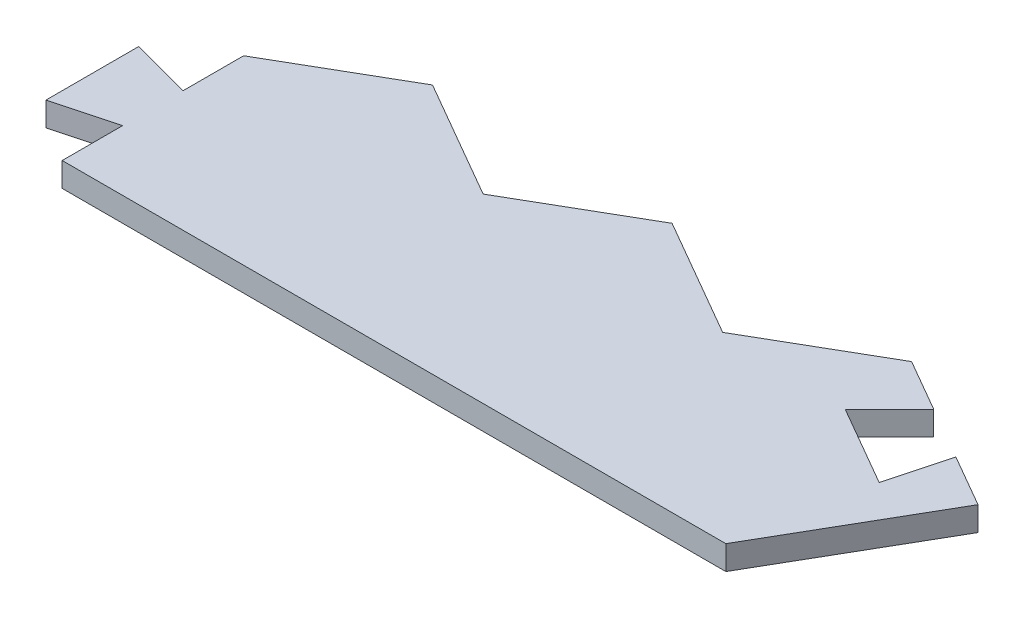
ISO-10303-21;
HEADER;
FILE_DESCRIPTION(('STEP AP214'),'2;1');
FILE_NAME('part.step','',(''),(''),'','','');
FILE_SCHEMA(('AUTOMOTIVE_DESIGN { 1 0 10303 214 1 1 1 1 }'));
ENDSEC;
DATA;
#1=APPLICATION_CONTEXT('core data for automotive mechanical design processes');
#2=APPLICATION_PROTOCOL_DEFINITION('international standard','automotive_design',2000,#1);
#3=PRODUCT_CONTEXT('',#1,'mechanical');
#4=PRODUCT('Part','Part','',(#3));
#5=PRODUCT_RELATED_PRODUCT_CATEGORY('part','',(#4));
#6=PRODUCT_DEFINITION_FORMATION('','',#4);
#7=PRODUCT_DEFINITION_CONTEXT('part definition',#1,'design');
#8=PRODUCT_DEFINITION('design','',#6,#7);
#9=PRODUCT_DEFINITION_SHAPE('','',#8);
#10=(LENGTH_UNIT() NAMED_UNIT(*) SI_UNIT(.MILLI.,.METRE.));
#11=(NAMED_UNIT(*) PLANE_ANGLE_UNIT() SI_UNIT($,.RADIAN.));
#12=(NAMED_UNIT(*) SI_UNIT($,.STERADIAN.) SOLID_ANGLE_UNIT());
#13=UNCERTAINTY_MEASURE_WITH_UNIT(LENGTH_MEASURE(1.E-05),#10,'distance_accuracy_value','');
#14=(GEOMETRIC_REPRESENTATION_CONTEXT(3) GLOBAL_UNCERTAINTY_ASSIGNED_CONTEXT((#13)) GLOBAL_UNIT_ASSIGNED_CONTEXT((#10,
#11,#12)) REPRESENTATION_CONTEXT('',''));
#15=CARTESIAN_POINT('',(0.,0.,0.));
#16=DIRECTION('',(0.,0.,1.));
#17=DIRECTION('',(1.,0.,0.));
#18=AXIS2_PLACEMENT_3D('',#15,#16,#17);
#19=CARTESIAN_POINT('',(0.,8.,0.));
#20=DIRECTION('',(1.,0.,0.));
#21=DIRECTION('',(0.,0.,-1.));
#22=AXIS2_PLACEMENT_3D('',#19,#20,#21);
#23=PLANE('',#22);
#24=DIRECTION('',(0.,0.,1.));
#25=VECTOR('',#24,1.);
#26=CARTESIAN_POINT('',(0.,0.,0.));
#27=LINE('',#26,#25);
#28=CARTESIAN_POINT('',(0.,0.,-20.));
#29=VERTEX_POINT('',#28);
#30=CARTESIAN_POINT('',(0.,0.,0.));
#31=VERTEX_POINT('',#30);
#32=EDGE_CURVE('E182',#29,#31,#27,.T.);
#33=ORIENTED_EDGE('',*,*,#32,.T.);
#34=DIRECTION('',(0.,-1.,0.));
#35=VECTOR('',#34,1.);
#36=CARTESIAN_POINT('',(0.,8.,0.));
#37=LINE('',#36,#35);
#38=CARTESIAN_POINT('',(0.,8.,0.));
#39=VERTEX_POINT('',#38);
#40=EDGE_CURVE('E11',#39,#31,#37,.T.);
#41=ORIENTED_EDGE('',*,*,#40,.F.);
#42=DIRECTION('',(0.,0.,1.));
#43=VECTOR('',#42,1.);
#44=CARTESIAN_POINT('',(0.,8.,0.));
#45=LINE('',#44,#43);
#46=CARTESIAN_POINT('',(0.,8.,-20.));
#47=VERTEX_POINT('',#46);
#48=EDGE_CURVE('E214',#47,#39,#45,.T.);
#49=ORIENTED_EDGE('',*,*,#48,.F.);
#50=DIRECTION('',(0.,-1.,0.));
#51=VECTOR('',#50,1.);
#52=CARTESIAN_POINT('',(0.,8.,-20.));
#53=LINE('',#52,#51);
#54=EDGE_CURVE('E178',#47,#29,#53,.T.);
#55=ORIENTED_EDGE('',*,*,#54,.T.);
#56=EDGE_LOOP('',(#33,#41,#49,#55));
#57=FACE_BOUND('',#56,.T.);
#58=ADVANCED_FACE('F32',(#57),#23,.F.);
#59=CARTESIAN_POINT('',(0.,8.,0.));
#60=DIRECTION('',(0.,0.,-1.));
#61=DIRECTION('',(-1.,0.,0.));
#62=AXIS2_PLACEMENT_3D('',#59,#60,#61);
#63=PLANE('',#62);
#64=DIRECTION('',(1.,0.,0.));
#65=VECTOR('',#64,1.);
#66=CARTESIAN_POINT('',(0.,0.,0.));
#67=LINE('',#66,#65);
#68=CARTESIAN_POINT('',(219.497025340512,0.,0.));
#69=VERTEX_POINT('',#68);
#70=EDGE_CURVE('E185',#31,#69,#67,.T.);
#71=ORIENTED_EDGE('',*,*,#70,.T.);
#72=DIRECTION('',(0.,-1.,0.));
#73=VECTOR('',#72,1.);
#74=CARTESIAN_POINT('',(219.497025340512,8.,0.));
#75=LINE('',#74,#73);
#76=CARTESIAN_POINT('',(219.497025340512,8.,0.));
#77=VERTEX_POINT('',#76);
#78=EDGE_CURVE('E40',#77,#69,#75,.T.);
#79=ORIENTED_EDGE('',*,*,#78,.F.);
#80=DIRECTION('',(1.,0.,0.));
#81=VECTOR('',#80,1.);
#82=CARTESIAN_POINT('',(0.,8.,0.));
#83=LINE('',#82,#81);
#84=EDGE_CURVE('E118',#39,#77,#83,.T.);
#85=ORIENTED_EDGE('',*,*,#84,.F.);
#86=ORIENTED_EDGE('',*,*,#40,.T.);
#87=EDGE_LOOP('',(#71,#79,#85,#86));
#88=FACE_BOUND('',#87,.T.);
#89=ADVANCED_FACE('F317',(#88),#63,.F.);
#90=CARTESIAN_POINT('',(219.497025340512,8.,0.));
#91=DIRECTION('',(-0.86602540378444,0.,-0.499999999999998));
#92=DIRECTION('',(-0.499999999999998,0.,0.86602540378444));
#93=AXIS2_PLACEMENT_3D('',#90,#91,#92);
#94=PLANE('',#93);
#95=DIRECTION('',(0.499999999999998,0.,-0.86602540378444));
#96=VECTOR('',#95,1.);
#97=CARTESIAN_POINT('',(219.497025340512,0.,0.));
#98=LINE('',#97,#96);
#99=CARTESIAN_POINT('',(250.021534072567,0.,-52.8699999999997));
#100=VERTEX_POINT('',#99);
#101=EDGE_CURVE('E187',#69,#100,#98,.T.);
#102=ORIENTED_EDGE('',*,*,#101,.T.);
#103=DIRECTION('',(0.,-1.,0.));
#104=VECTOR('',#103,1.);
#105=CARTESIAN_POINT('',(250.021534072567,8.,-52.8699999999997));
#106=LINE('',#105,#104);
#107=CARTESIAN_POINT('',(250.021534072567,8.,-52.8699999999997));
#108=VERTEX_POINT('',#107);
#109=EDGE_CURVE('E248',#108,#100,#106,.T.);
#110=ORIENTED_EDGE('',*,*,#109,.F.);
#111=DIRECTION('',(0.499999999999998,0.,-0.86602540378444));
#112=VECTOR('',#111,1.);
#113=CARTESIAN_POINT('',(219.497025340512,8.,0.));
#114=LINE('',#113,#112);
#115=EDGE_CURVE('E256',#77,#108,#114,.T.);
#116=ORIENTED_EDGE('',*,*,#115,.F.);
#117=ORIENTED_EDGE('',*,*,#78,.T.);
#118=EDGE_LOOP('',(#102,#110,#116,#117));
#119=FACE_BOUND('',#118,.T.);
#120=ADVANCED_FACE('F254',(#119),#94,.F.);
#121=CARTESIAN_POINT('',(232.701025996879,8.,-62.8699999999998));
#122=DIRECTION('',(-0.500000000000004,0.,0.866025403784436));
#123=DIRECTION('',(0.866025403784436,0.,0.500000000000004));
#124=AXIS2_PLACEMENT_3D('',#121,#122,#123);
#125=PLANE('',#124);
#126=DIRECTION('',(-0.866025403784436,0.,-0.500000000000004));
#127=VECTOR('',#126,1.);
#128=CARTESIAN_POINT('',(232.701025996879,0.,-62.8699999999998));
#129=LINE('',#128,#127);
#130=CARTESIAN_POINT('',(232.701025996879,0.,-62.8699999999998));
#131=VERTEX_POINT('',#130);
#132=EDGE_CURVE('E189',#100,#131,#129,.T.);
#133=ORIENTED_EDGE('',*,*,#132,.T.);
#134=DIRECTION('',(0.,-1.,0.));
#135=VECTOR('',#134,1.);
#136=CARTESIAN_POINT('',(232.701025996879,8.,-62.8699999999998));
#137=LINE('',#136,#135);
#138=CARTESIAN_POINT('',(232.701025996879,8.,-62.8699999999998));
#139=VERTEX_POINT('',#138);
#140=EDGE_CURVE('E245',#139,#131,#137,.T.);
#141=ORIENTED_EDGE('',*,*,#140,.F.);
#142=DIRECTION('',(-0.866025403784436,0.,-0.500000000000004));
#143=VECTOR('',#142,1.);
#144=CARTESIAN_POINT('',(232.701025996879,8.,-62.8699999999998));
#145=LINE('',#144,#143);
#146=EDGE_CURVE('E274',#108,#139,#145,.T.);
#147=ORIENTED_EDGE('',*,*,#146,.F.);
#148=ORIENTED_EDGE('',*,*,#109,.T.);
#149=EDGE_LOOP('',(#133,#141,#147,#148));
#150=FACE_BOUND('',#149,.T.);
#151=ADVANCED_FACE('F265',(#150),#125,.F.);
#152=CARTESIAN_POINT('',(227.342042148256,8.,-42.8699999999998));
#153=DIRECTION('',(0.965925826289068,0.,0.258819045102521));
#154=DIRECTION('',(0.258819045102521,0.,-0.965925826289068));
#155=AXIS2_PLACEMENT_3D('',#152,#153,#154);
#156=PLANE('',#155);
#157=DIRECTION('',(-0.258819045102521,0.,0.965925826289068));
#158=VECTOR('',#157,1.);
#159=CARTESIAN_POINT('',(227.342042148256,0.,-42.8699999999998));
#160=LINE('',#159,#158);
#161=CARTESIAN_POINT('',(227.342042148256,0.,-42.8699999999998));
#162=VERTEX_POINT('',#161);
#163=EDGE_CURVE('E191',#131,#162,#160,.T.);
#164=ORIENTED_EDGE('',*,*,#163,.T.);
#165=DIRECTION('',(0.,-1.,0.));
#166=VECTOR('',#165,1.);
#167=CARTESIAN_POINT('',(227.342042148256,8.,-42.8699999999998));
#168=LINE('',#167,#166);
#169=CARTESIAN_POINT('',(227.342042148256,8.,-42.8699999999998));
#170=VERTEX_POINT('',#169);
#171=EDGE_CURVE('E242',#170,#162,#168,.T.);
#172=ORIENTED_EDGE('',*,*,#171,.F.);
#173=DIRECTION('',(-0.258819045102521,0.,0.965925826289068));
#174=VECTOR('',#173,1.);
#175=CARTESIAN_POINT('',(227.342042148256,8.,-42.8699999999998));
#176=LINE('',#175,#174);
#177=EDGE_CURVE('E271',#139,#170,#176,.T.);
#178=ORIENTED_EDGE('',*,*,#177,.F.);
#179=ORIENTED_EDGE('',*,*,#140,.T.);
#180=EDGE_LOOP('',(#164,#172,#178,#179));
#181=FACE_BOUND('',#180,.T.);
#182=ADVANCED_FACE('F269',(#181),#156,.F.);
#183=CARTESIAN_POINT('',(200.739501769812,8.,-58.2289838486224));
#184=DIRECTION('',(-0.500000000000003,0.,0.866025403784437));
#185=DIRECTION('',(0.866025403784437,0.,0.500000000000003));
#186=AXIS2_PLACEMENT_3D('',#183,#184,#185);
#187=PLANE('',#186);
#188=DIRECTION('',(-0.866025403784437,0.,-0.500000000000003));
#189=VECTOR('',#188,1.);
#190=CARTESIAN_POINT('',(200.739501769812,0.,-58.2289838486224));
#191=LINE('',#190,#189);
#192=CARTESIAN_POINT('',(200.739501769812,0.,-58.2289838486224));
#193=VERTEX_POINT('',#192);
#194=EDGE_CURVE('E193',#162,#193,#191,.T.);
#195=ORIENTED_EDGE('',*,*,#194,.T.);
#196=DIRECTION('',(0.,-1.,0.));
#197=VECTOR('',#196,1.);
#198=CARTESIAN_POINT('',(200.739501769812,8.,-58.2289838486224));
#199=LINE('',#198,#197);
#200=CARTESIAN_POINT('',(200.739501769812,8.,-58.2289838486224));
#201=VERTEX_POINT('',#200);
#202=EDGE_CURVE('E239',#201,#193,#199,.T.);
#203=ORIENTED_EDGE('',*,*,#202,.F.);
#204=DIRECTION('',(-0.866025403784437,0.,-0.500000000000003));
#205=VECTOR('',#204,1.);
#206=CARTESIAN_POINT('',(200.739501769812,8.,-58.2289838486224));
#207=LINE('',#206,#205);
#208=EDGE_CURVE('E273',#170,#201,#207,.T.);
#209=ORIENTED_EDGE('',*,*,#208,.F.);
#210=ORIENTED_EDGE('',*,*,#171,.T.);
#211=EDGE_LOOP('',(#195,#203,#209,#210));
#212=FACE_BOUND('',#211,.T.);
#213=ADVANCED_FACE('F330',(#212),#187,.F.);
#214=CARTESIAN_POINT('',(215.38051792119,8.,-72.8699999999998));
#215=DIRECTION('',(-0.707106781186541,0.,-0.707106781186554));
#216=DIRECTION('',(-0.707106781186554,0.,0.707106781186541));
#217=AXIS2_PLACEMENT_3D('',#214,#215,#216);
#218=PLANE('',#217);
#219=DIRECTION('',(0.707106781186554,0.,-0.707106781186541));
#220=VECTOR('',#219,1.);
#221=CARTESIAN_POINT('',(215.38051792119,0.,-72.8699999999998));
#222=LINE('',#221,#220);
#223=CARTESIAN_POINT('',(215.38051792119,0.,-72.8699999999998));
#224=VERTEX_POINT('',#223);
#225=EDGE_CURVE('E195',#193,#224,#222,.T.);
#226=ORIENTED_EDGE('',*,*,#225,.T.);
#227=DIRECTION('',(0.,-1.,0.));
#228=VECTOR('',#227,1.);
#229=CARTESIAN_POINT('',(215.38051792119,8.,-72.8699999999998));
#230=LINE('',#229,#228);
#231=CARTESIAN_POINT('',(215.38051792119,8.,-72.8699999999998));
#232=VERTEX_POINT('',#231);
#233=EDGE_CURVE('E236',#232,#224,#230,.T.);
#234=ORIENTED_EDGE('',*,*,#233,.F.);
#235=DIRECTION('',(0.707106781186554,0.,-0.707106781186541));
#236=VECTOR('',#235,1.);
#237=CARTESIAN_POINT('',(215.38051792119,8.,-72.8699999999998));
#238=LINE('',#237,#236);
#239=EDGE_CURVE('E276',#201,#232,#238,.T.);
#240=ORIENTED_EDGE('',*,*,#239,.F.);
#241=ORIENTED_EDGE('',*,*,#202,.T.);
#242=EDGE_LOOP('',(#226,#234,#240,#241));
#243=FACE_BOUND('',#242,.T.);
#244=ADVANCED_FACE('F333',(#243),#218,.F.);
#245=CARTESIAN_POINT('',(198.060009845501,8.,-82.8699999999999));
#246=DIRECTION('',(-0.500000000000001,0.,0.866025403784438));
#247=DIRECTION('',(0.866025403784438,0.,0.500000000000001));
#248=AXIS2_PLACEMENT_3D('',#245,#246,#247);
#249=PLANE('',#248);
#250=DIRECTION('',(-0.866025403784438,0.,-0.500000000000001));
#251=VECTOR('',#250,1.);
#252=CARTESIAN_POINT('',(198.060009845501,0.,-82.8699999999999));
#253=LINE('',#252,#251);
#254=CARTESIAN_POINT('',(198.060009845501,0.,-82.8699999999999));
#255=VERTEX_POINT('',#254);
#256=EDGE_CURVE('E197',#224,#255,#253,.T.);
#257=ORIENTED_EDGE('',*,*,#256,.T.);
#258=DIRECTION('',(0.,-1.,0.));
#259=VECTOR('',#258,1.);
#260=CARTESIAN_POINT('',(198.060009845501,8.,-82.8699999999999));
#261=LINE('',#260,#259);
#262=CARTESIAN_POINT('',(198.060009845501,8.,-82.8699999999999));
#263=VERTEX_POINT('',#262);
#264=EDGE_CURVE('E233',#263,#255,#261,.T.);
#265=ORIENTED_EDGE('',*,*,#264,.F.);
#266=DIRECTION('',(-0.866025403784438,0.,-0.500000000000001));
#267=VECTOR('',#266,1.);
#268=CARTESIAN_POINT('',(198.060009845501,8.,-82.8699999999999));
#269=LINE('',#268,#267);
#270=EDGE_CURVE('E282',#232,#263,#269,.T.);
#271=ORIENTED_EDGE('',*,*,#270,.F.);
#272=ORIENTED_EDGE('',*,*,#233,.T.);
#273=EDGE_LOOP('',(#257,#265,#271,#272));
#274=FACE_BOUND('',#273,.T.);
#275=ADVANCED_FACE('F337',(#274),#249,.F.);
#276=CARTESIAN_POINT('',(158.448007876401,8.,-60.));
#277=DIRECTION('',(0.499999999999999,0.,0.866025403784439));
#278=DIRECTION('',(0.866025403784439,0.,-0.499999999999999));
#279=AXIS2_PLACEMENT_3D('',#276,#277,#278);
#280=PLANE('',#279);
#281=DIRECTION('',(-0.866025403784439,0.,0.499999999999999));
#282=VECTOR('',#281,1.);
#283=CARTESIAN_POINT('',(158.448007876401,0.,-60.));
#284=LINE('',#283,#282);
#285=CARTESIAN_POINT('',(158.448007876401,0.,-60.));
#286=VERTEX_POINT('',#285);
#287=EDGE_CURVE('E199',#255,#286,#284,.T.);
#288=ORIENTED_EDGE('',*,*,#287,.T.);
#289=DIRECTION('',(0.,-1.,0.));
#290=VECTOR('',#289,1.);
#291=CARTESIAN_POINT('',(158.448007876401,8.,-60.));
#292=LINE('',#291,#290);
#293=CARTESIAN_POINT('',(158.448007876401,8.,-60.));
#294=VERTEX_POINT('',#293);
#295=EDGE_CURVE('E230',#294,#286,#292,.T.);
#296=ORIENTED_EDGE('',*,*,#295,.F.);
#297=DIRECTION('',(-0.866025403784439,0.,0.499999999999999));
#298=VECTOR('',#297,1.);
#299=CARTESIAN_POINT('',(158.448007876401,8.,-60.));
#300=LINE('',#299,#298);
#301=EDGE_CURVE('E284',#263,#294,#300,.T.);
#302=ORIENTED_EDGE('',*,*,#301,.F.);
#303=ORIENTED_EDGE('',*,*,#264,.T.);
#304=EDGE_LOOP('',(#288,#296,#302,#303));
#305=FACE_BOUND('',#304,.T.);
#306=ADVANCED_FACE('F341',(#305),#280,.F.);
#307=CARTESIAN_POINT('',(118.836005907301,8.,-82.8699999999999));
#308=DIRECTION('',(-0.500000000000004,0.,0.866025403784436));
#309=DIRECTION('',(0.866025403784436,0.,0.500000000000004));
#310=AXIS2_PLACEMENT_3D('',#307,#308,#309);
#311=PLANE('',#310);
#312=DIRECTION('',(-0.866025403784436,0.,-0.500000000000004));
#313=VECTOR('',#312,1.);
#314=CARTESIAN_POINT('',(118.836005907301,0.,-82.8699999999999));
#315=LINE('',#314,#313);
#316=CARTESIAN_POINT('',(118.836005907301,0.,-82.8699999999999));
#317=VERTEX_POINT('',#316);
#318=EDGE_CURVE('E201',#286,#317,#315,.T.);
#319=ORIENTED_EDGE('',*,*,#318,.T.);
#320=DIRECTION('',(0.,-1.,0.));
#321=VECTOR('',#320,1.);
#322=CARTESIAN_POINT('',(118.836005907301,8.,-82.8699999999999));
#323=LINE('',#322,#321);
#324=CARTESIAN_POINT('',(118.836005907301,8.,-82.8699999999999));
#325=VERTEX_POINT('',#324);
#326=EDGE_CURVE('E227',#325,#317,#323,.T.);
#327=ORIENTED_EDGE('',*,*,#326,.F.);
#328=DIRECTION('',(-0.866025403784436,0.,-0.500000000000004));
#329=VECTOR('',#328,1.);
#330=CARTESIAN_POINT('',(118.836005907301,8.,-82.8699999999999));
#331=LINE('',#330,#329);
#332=EDGE_CURVE('E286',#294,#325,#331,.T.);
#333=ORIENTED_EDGE('',*,*,#332,.F.);
#334=ORIENTED_EDGE('',*,*,#295,.T.);
#335=EDGE_LOOP('',(#319,#327,#333,#334));
#336=FACE_BOUND('',#335,.T.);
#337=ADVANCED_FACE('F345',(#336),#311,.F.);
#338=CARTESIAN_POINT('',(79.2240039382004,8.,-59.9999999999997));
#339=DIRECTION('',(0.499999999999998,0.,0.86602540378444));
#340=DIRECTION('',(0.86602540378444,0.,-0.499999999999998));
#341=AXIS2_PLACEMENT_3D('',#338,#339,#340);
#342=PLANE('',#341);
#343=DIRECTION('',(-0.86602540378444,0.,0.499999999999998));
#344=VECTOR('',#343,1.);
#345=CARTESIAN_POINT('',(79.2240039382004,0.,-59.9999999999997));
#346=LINE('',#345,#344);
#347=CARTESIAN_POINT('',(79.2240039382004,0.,-59.9999999999997));
#348=VERTEX_POINT('',#347);
#349=EDGE_CURVE('E203',#317,#348,#346,.T.);
#350=ORIENTED_EDGE('',*,*,#349,.T.);
#351=DIRECTION('',(0.,-1.,0.));
#352=VECTOR('',#351,1.);
#353=CARTESIAN_POINT('',(79.2240039382004,8.,-59.9999999999997));
#354=LINE('',#353,#352);
#355=CARTESIAN_POINT('',(79.2240039382004,8.,-59.9999999999997));
#356=VERTEX_POINT('',#355);
#357=EDGE_CURVE('E224',#356,#348,#354,.T.);
#358=ORIENTED_EDGE('',*,*,#357,.F.);
#359=DIRECTION('',(-0.86602540378444,0.,0.499999999999998));
#360=VECTOR('',#359,1.);
#361=CARTESIAN_POINT('',(79.2240039382004,8.,-59.9999999999997));
#362=LINE('',#361,#360);
#363=EDGE_CURVE('E288',#325,#356,#362,.T.);
#364=ORIENTED_EDGE('',*,*,#363,.F.);
#365=ORIENTED_EDGE('',*,*,#326,.T.);
#366=EDGE_LOOP('',(#350,#358,#364,#365));
#367=FACE_BOUND('',#366,.T.);
#368=ADVANCED_FACE('F349',(#367),#342,.F.);
#369=CARTESIAN_POINT('',(39.6120019691003,8.,-82.8699999999999));
#370=DIRECTION('',(-0.500000000000004,0.,0.866025403784436));
#371=DIRECTION('',(0.866025403784436,0.,0.500000000000004));
#372=AXIS2_PLACEMENT_3D('',#369,#370,#371);
#373=PLANE('',#372);
#374=DIRECTION('',(-0.866025403784436,0.,-0.500000000000004));
#375=VECTOR('',#374,1.);
#376=CARTESIAN_POINT('',(39.6120019691003,0.,-82.8699999999999));
#377=LINE('',#376,#375);
#378=CARTESIAN_POINT('',(39.6120019691003,0.,-82.8699999999999));
#379=VERTEX_POINT('',#378);
#380=EDGE_CURVE('E205',#348,#379,#377,.T.);
#381=ORIENTED_EDGE('',*,*,#380,.T.);
#382=DIRECTION('',(0.,-1.,0.));
#383=VECTOR('',#382,1.);
#384=CARTESIAN_POINT('',(39.6120019691003,8.,-82.8699999999999));
#385=LINE('',#384,#383);
#386=CARTESIAN_POINT('',(39.6120019691003,8.,-82.8699999999999));
#387=VERTEX_POINT('',#386);
#388=EDGE_CURVE('E221',#387,#379,#385,.T.);
#389=ORIENTED_EDGE('',*,*,#388,.F.);
#390=DIRECTION('',(-0.866025403784436,0.,-0.500000000000004));
#391=VECTOR('',#390,1.);
#392=CARTESIAN_POINT('',(39.6120019691003,8.,-82.8699999999999));
#393=LINE('',#392,#391);
#394=EDGE_CURVE('E290',#356,#387,#393,.T.);
#395=ORIENTED_EDGE('',*,*,#394,.F.);
#396=ORIENTED_EDGE('',*,*,#357,.T.);
#397=EDGE_LOOP('',(#381,#389,#395,#396));
#398=FACE_BOUND('',#397,.T.);
#399=ADVANCED_FACE('F353',(#398),#373,.F.);
#400=CARTESIAN_POINT('',(0.,8.,-60.));
#401=DIRECTION('',(0.499999999999999,0.,0.86602540378444));
#402=DIRECTION('',(0.86602540378444,0.,-0.499999999999999));
#403=AXIS2_PLACEMENT_3D('',#400,#401,#402);
#404=PLANE('',#403);
#405=DIRECTION('',(-0.86602540378444,0.,0.499999999999999));
#406=VECTOR('',#405,1.);
#407=CARTESIAN_POINT('',(0.,0.,-60.));
#408=LINE('',#407,#406);
#409=CARTESIAN_POINT('',(0.,0.,-60.));
#410=VERTEX_POINT('',#409);
#411=EDGE_CURVE('E207',#379,#410,#408,.T.);
#412=ORIENTED_EDGE('',*,*,#411,.T.);
#413=DIRECTION('',(0.,-1.,0.));
#414=VECTOR('',#413,1.);
#415=CARTESIAN_POINT('',(0.,8.,-60.));
#416=LINE('',#415,#414);
#417=CARTESIAN_POINT('',(0.,8.,-60.));
#418=VERTEX_POINT('',#417);
#419=EDGE_CURVE('E218',#418,#410,#416,.T.);
#420=ORIENTED_EDGE('',*,*,#419,.F.);
#421=DIRECTION('',(-0.86602540378444,0.,0.499999999999999));
#422=VECTOR('',#421,1.);
#423=CARTESIAN_POINT('',(0.,8.,-60.));
#424=LINE('',#423,#422);
#425=EDGE_CURVE('E292',#387,#418,#424,.T.);
#426=ORIENTED_EDGE('',*,*,#425,.F.);
#427=ORIENTED_EDGE('',*,*,#388,.T.);
#428=EDGE_LOOP('',(#412,#420,#426,#427));
#429=FACE_BOUND('',#428,.T.);
#430=ADVANCED_FACE('F298',(#429),#404,.F.);
#431=CARTESIAN_POINT('',(0.,8.,-40.));
#432=DIRECTION('',(1.,0.,0.));
#433=DIRECTION('',(0.,0.,-1.));
#434=AXIS2_PLACEMENT_3D('',#431,#432,#433);
#435=PLANE('',#434);
#436=DIRECTION('',(0.,0.,1.));
#437=VECTOR('',#436,1.);
#438=CARTESIAN_POINT('',(0.,0.,-40.));
#439=LINE('',#438,#437);
#440=CARTESIAN_POINT('',(0.,0.,-40.));
#441=VERTEX_POINT('',#440);
#442=EDGE_CURVE('E209',#410,#441,#439,.T.);
#443=ORIENTED_EDGE('',*,*,#442,.T.);
#444=DIRECTION('',(0.,-1.,0.));
#445=VECTOR('',#444,1.);
#446=CARTESIAN_POINT('',(0.,8.,-40.));
#447=LINE('',#446,#445);
#448=CARTESIAN_POINT('',(0.,8.,-40.));
#449=VERTEX_POINT('',#448);
#450=EDGE_CURVE('E173',#449,#441,#447,.T.);
#451=ORIENTED_EDGE('',*,*,#450,.F.);
#452=DIRECTION('',(0.,0.,1.));
#453=VECTOR('',#452,1.);
#454=CARTESIAN_POINT('',(0.,8.,-40.));
#455=LINE('',#454,#453);
#456=EDGE_CURVE('E164',#418,#449,#455,.T.);
#457=ORIENTED_EDGE('',*,*,#456,.F.);
#458=ORIENTED_EDGE('',*,*,#419,.T.);
#459=EDGE_LOOP('',(#443,#451,#457,#458));
#460=FACE_BOUND('',#459,.T.);
#461=ADVANCED_FACE('F302',(#460),#435,.F.);
#462=CARTESIAN_POINT('',(0.,8.,-40.));
#463=DIRECTION('',(-0.258819045102518,0.,0.965925826289069));
#464=DIRECTION('',(0.965925826289069,0.,0.258819045102518));
#465=AXIS2_PLACEMENT_3D('',#462,#463,#464);
#466=PLANE('',#465);
#467=DIRECTION('',(-0.965925826289069,0.,-0.258819045102518));
#468=VECTOR('',#467,1.);
#469=CARTESIAN_POINT('',(0.,0.,-40.));
#470=LINE('',#469,#468);
#471=CARTESIAN_POINT('',(-20.,0.,-45.3589838486224));
#472=VERTEX_POINT('',#471);
#473=EDGE_CURVE('E172',#441,#472,#470,.T.);
#474=ORIENTED_EDGE('',*,*,#473,.T.);
#475=DIRECTION('',(0.,-1.,0.));
#476=VECTOR('',#475,1.);
#477=CARTESIAN_POINT('',(-20.,8.,-45.3589838486224));
#478=LINE('',#477,#476);
#479=CARTESIAN_POINT('',(-20.,8.,-45.3589838486224));
#480=VERTEX_POINT('',#479);
#481=EDGE_CURVE('E169',#480,#472,#478,.T.);
#482=ORIENTED_EDGE('',*,*,#481,.F.);
#483=DIRECTION('',(-0.965925826289069,0.,-0.258819045102518));
#484=VECTOR('',#483,1.);
#485=CARTESIAN_POINT('',(0.,8.,-40.));
#486=LINE('',#485,#484);
#487=EDGE_CURVE('E158',#449,#480,#486,.T.);
#488=ORIENTED_EDGE('',*,*,#487,.F.);
#489=ORIENTED_EDGE('',*,*,#450,.T.);
#490=EDGE_LOOP('',(#474,#482,#488,#489));
#491=FACE_BOUND('',#490,.T.);
#492=ADVANCED_FACE('F170',(#491),#466,.F.);
#493=CARTESIAN_POINT('',(-20.,8.,-45.3589838486224));
#494=DIRECTION('',(1.,0.,0.));
#495=DIRECTION('',(0.,0.,-1.));
#496=AXIS2_PLACEMENT_3D('',#493,#494,#495);
#497=PLANE('',#496);
#498=DIRECTION('',(0.,0.,1.));
#499=VECTOR('',#498,1.);
#500=CARTESIAN_POINT('',(-20.,0.,-45.3589838486224));
#501=LINE('',#500,#499);
#502=CARTESIAN_POINT('',(-20.,0.,-14.6410161513776));
#503=VERTEX_POINT('',#502);
#504=EDGE_CURVE('E104',#472,#503,#501,.T.);
#505=ORIENTED_EDGE('',*,*,#504,.T.);
#506=DIRECTION('',(0.,-1.,0.));
#507=VECTOR('',#506,1.);
#508=CARTESIAN_POINT('',(-20.,8.,-14.6410161513776));
#509=LINE('',#508,#507);
#510=CARTESIAN_POINT('',(-20.,8.,-14.6410161513776));
#511=VERTEX_POINT('',#510);
#512=EDGE_CURVE('E174',#511,#503,#509,.T.);
#513=ORIENTED_EDGE('',*,*,#512,.F.);
#514=DIRECTION('',(0.,0.,1.));
#515=VECTOR('',#514,1.);
#516=CARTESIAN_POINT('',(-20.,8.,-45.3589838486224));
#517=LINE('',#516,#515);
#518=EDGE_CURVE('E162',#480,#511,#517,.T.);
#519=ORIENTED_EDGE('',*,*,#518,.F.);
#520=ORIENTED_EDGE('',*,*,#481,.T.);
#521=EDGE_LOOP('',(#505,#513,#519,#520));
#522=FACE_BOUND('',#521,.T.);
#523=ADVANCED_FACE('F176',(#522),#497,.F.);
#524=CARTESIAN_POINT('',(-20.,8.,-14.6410161513776));
#525=DIRECTION('',(-0.258819045102518,0.,-0.965925826289069));
#526=DIRECTION('',(-0.965925826289069,0.,0.258819045102518));
#527=AXIS2_PLACEMENT_3D('',#524,#525,#526);
#528=PLANE('',#527);
#529=DIRECTION('',(0.965925826289069,0.,-0.258819045102518));
#530=VECTOR('',#529,1.);
#531=CARTESIAN_POINT('',(-20.,0.,-14.6410161513776));
#532=LINE('',#531,#530);
#533=EDGE_CURVE('E110',#503,#29,#532,.T.);
#534=ORIENTED_EDGE('',*,*,#533,.T.);
#535=ORIENTED_EDGE('',*,*,#54,.F.);
#536=DIRECTION('',(0.965925826289069,0.,-0.258819045102518));
#537=VECTOR('',#536,1.);
#538=CARTESIAN_POINT('',(-20.,8.,-14.6410161513776));
#539=LINE('',#538,#537);
#540=EDGE_CURVE('E48',#511,#47,#539,.T.);
#541=ORIENTED_EDGE('',*,*,#540,.F.);
#542=ORIENTED_EDGE('',*,*,#512,.T.);
#543=EDGE_LOOP('',(#534,#535,#541,#542));
#544=FACE_BOUND('',#543,.T.);
#545=ADVANCED_FACE('F306',(#544),#528,.F.);
#546=CARTESIAN_POINT('',(0.,8.,0.));
#547=DIRECTION('',(0.,-1.,0.));
#548=DIRECTION('',(0.,0.,-1.));
#549=AXIS2_PLACEMENT_3D('',#546,#547,#548);
#550=PLANE('',#549);
#551=ORIENTED_EDGE('',*,*,#48,.T.);
#552=ORIENTED_EDGE('',*,*,#84,.T.);
#553=ORIENTED_EDGE('',*,*,#115,.T.);
#554=ORIENTED_EDGE('',*,*,#146,.T.);
#555=ORIENTED_EDGE('',*,*,#177,.T.);
#556=ORIENTED_EDGE('',*,*,#208,.T.);
#557=ORIENTED_EDGE('',*,*,#239,.T.);
#558=ORIENTED_EDGE('',*,*,#270,.T.);
#559=ORIENTED_EDGE('',*,*,#301,.T.);
#560=ORIENTED_EDGE('',*,*,#332,.T.);
#561=ORIENTED_EDGE('',*,*,#363,.T.);
#562=ORIENTED_EDGE('',*,*,#394,.T.);
#563=ORIENTED_EDGE('',*,*,#425,.T.);
#564=ORIENTED_EDGE('',*,*,#456,.T.);
#565=ORIENTED_EDGE('',*,*,#487,.T.);
#566=ORIENTED_EDGE('',*,*,#518,.T.);
#567=ORIENTED_EDGE('',*,*,#540,.T.);
#568=EDGE_LOOP('',(#551,#552,#553,#554,#555,#556,#557,#558,#559,#560,#561,#562,#563,#564,#565,
#566,#567));
#569=FACE_BOUND('',#568,.T.);
#570=ADVANCED_FACE('F160',(#569),#550,.F.);
#571=CARTESIAN_POINT('',(0.,0.,0.));
#572=DIRECTION('',(0.,-1.,0.));
#573=DIRECTION('',(0.,0.,-1.));
#574=AXIS2_PLACEMENT_3D('',#571,#572,#573);
#575=PLANE('',#574);
#576=ORIENTED_EDGE('',*,*,#32,.F.);
#577=ORIENTED_EDGE('',*,*,#533,.F.);
#578=ORIENTED_EDGE('',*,*,#504,.F.);
#579=ORIENTED_EDGE('',*,*,#473,.F.);
#580=ORIENTED_EDGE('',*,*,#442,.F.);
#581=ORIENTED_EDGE('',*,*,#411,.F.);
#582=ORIENTED_EDGE('',*,*,#380,.F.);
#583=ORIENTED_EDGE('',*,*,#349,.F.);
#584=ORIENTED_EDGE('',*,*,#318,.F.);
#585=ORIENTED_EDGE('',*,*,#287,.F.);
#586=ORIENTED_EDGE('',*,*,#256,.F.);
#587=ORIENTED_EDGE('',*,*,#225,.F.);
#588=ORIENTED_EDGE('',*,*,#194,.F.);
#589=ORIENTED_EDGE('',*,*,#163,.F.);
#590=ORIENTED_EDGE('',*,*,#132,.F.);
#591=ORIENTED_EDGE('',*,*,#101,.F.);
#592=ORIENTED_EDGE('',*,*,#70,.F.);
#593=EDGE_LOOP('',(#576,#577,#578,#579,#580,#581,#582,#583,#584,#585,#586,#587,#588,#589,#590,
#591,#592));
#594=FACE_BOUND('',#593,.T.);
#595=ADVANCED_FACE('F260',(#594),#575,.T.);
#596=CLOSED_SHELL('',(#58,#89,#120,#151,#182,#213,#244,#275,#306,#337,#368,#399,#430,#461,#492,
#523,#545,#570,#595));
#597=MANIFOLD_SOLID_BREP('B2',#596);
#598=ADVANCED_BREP_SHAPE_REPRESENTATION('',(#18,#597),#14);
#599=SHAPE_DEFINITION_REPRESENTATION(#9,#598);
ENDSEC;
END-ISO-10303-21;
